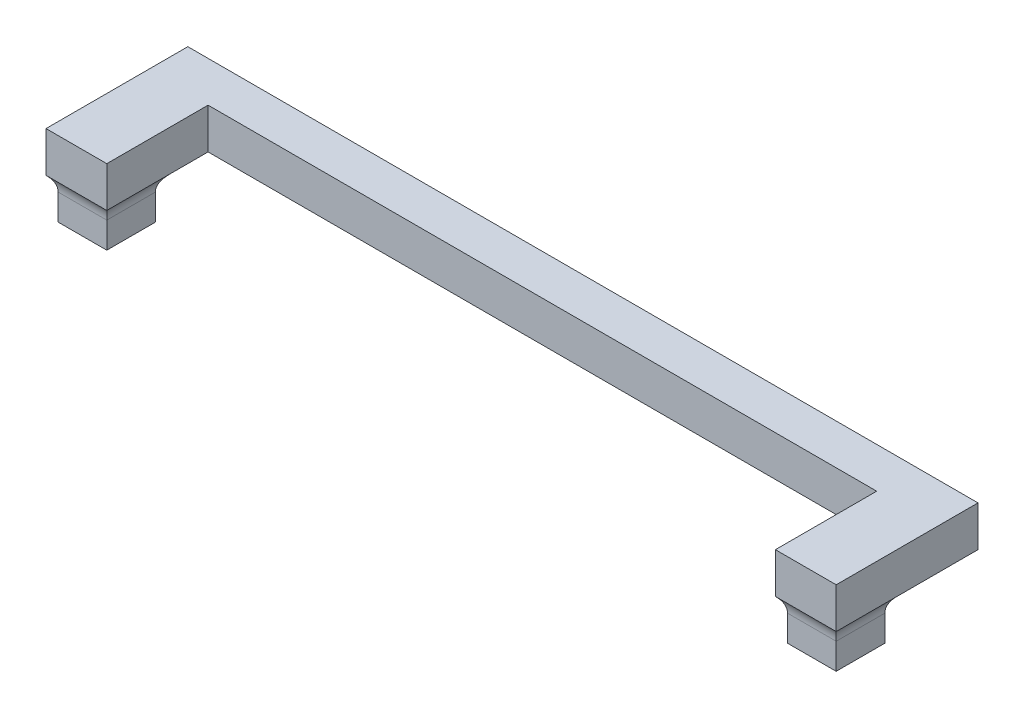
ISO-10303-21;
HEADER;
FILE_DESCRIPTION(('STEP AP214'),'2;1');
FILE_NAME('part.step','',(''),(''),'','','');
FILE_SCHEMA(('AUTOMOTIVE_DESIGN { 1 0 10303 214 1 1 1 1 }'));
ENDSEC;
DATA;
#1=APPLICATION_CONTEXT('core data for automotive mechanical design processes');
#2=APPLICATION_PROTOCOL_DEFINITION('international standard','automotive_design',2000,#1);
#3=PRODUCT_CONTEXT('',#1,'mechanical');
#4=PRODUCT('Part','Part','',(#3));
#5=PRODUCT_RELATED_PRODUCT_CATEGORY('part','',(#4));
#6=PRODUCT_DEFINITION_FORMATION('','',#4);
#7=PRODUCT_DEFINITION_CONTEXT('part definition',#1,'design');
#8=PRODUCT_DEFINITION('design','',#6,#7);
#9=PRODUCT_DEFINITION_SHAPE('','',#8);
#10=(LENGTH_UNIT() NAMED_UNIT(*) SI_UNIT(.MILLI.,.METRE.));
#11=(NAMED_UNIT(*) PLANE_ANGLE_UNIT() SI_UNIT($,.RADIAN.));
#12=(NAMED_UNIT(*) SI_UNIT($,.STERADIAN.) SOLID_ANGLE_UNIT());
#13=UNCERTAINTY_MEASURE_WITH_UNIT(LENGTH_MEASURE(1.E-05),#10,'distance_accuracy_value','');
#14=(GEOMETRIC_REPRESENTATION_CONTEXT(3) GLOBAL_UNCERTAINTY_ASSIGNED_CONTEXT((#13)) GLOBAL_UNIT_ASSIGNED_CONTEXT((#10,
#11,#12)) REPRESENTATION_CONTEXT('',''));
#15=CARTESIAN_POINT('',(0.,0.,0.));
#16=DIRECTION('',(0.,0.,1.));
#17=DIRECTION('',(1.,0.,0.));
#18=AXIS2_PLACEMENT_3D('',#15,#16,#17);
#19=CARTESIAN_POINT('',(6.858,5.08,-17.018));
#20=DIRECTION('',(0.,1.,0.));
#21=DIRECTION('',(0.,0.,1.));
#22=AXIS2_PLACEMENT_3D('',#19,#20,#21);
#23=PLANE('',#22);
#24=DIRECTION('',(0.,0.,-1.));
#25=VECTOR('',#24,1.);
#26=CARTESIAN_POINT('',(-84.582,5.08,0.762000000000001));
#27=LINE('',#26,#25);
#28=CARTESIAN_POINT('',(-84.582,5.08,-7.874));
#29=VERTEX_POINT('',#28);
#30=CARTESIAN_POINT('',(-84.582,5.08,-11.938));
#31=VERTEX_POINT('',#30);
#32=EDGE_CURVE('E228',#29,#31,#27,.T.);
#33=ORIENTED_EDGE('',*,*,#32,.F.);
#34=DIRECTION('',(1.,0.,0.));
#35=VECTOR('',#34,1.);
#36=CARTESIAN_POINT('',(-92.202,5.08,-7.874));
#37=LINE('',#36,#35);
#38=CARTESIAN_POINT('',(-92.202,5.08,-7.874));
#39=VERTEX_POINT('',#38);
#40=EDGE_CURVE('E388',#29,#39,#37,.F.);
#41=ORIENTED_EDGE('',*,*,#40,.T.);
#42=DIRECTION('',(0.,0.,1.));
#43=VECTOR('',#42,1.);
#44=CARTESIAN_POINT('',(-92.202,5.08,-17.018));
#45=LINE('',#44,#43);
#46=CARTESIAN_POINT('',(-92.202,5.08,-17.018));
#47=VERTEX_POINT('',#46);
#48=EDGE_CURVE('E240',#47,#39,#45,.T.);
#49=ORIENTED_EDGE('',*,*,#48,.F.);
#50=DIRECTION('',(-1.,0.,0.));
#51=VECTOR('',#50,1.);
#52=CARTESIAN_POINT('',(6.858,5.08,-17.018));
#53=LINE('',#52,#51);
#54=CARTESIAN_POINT('',(6.858,5.08,-17.018));
#55=VERTEX_POINT('',#54);
#56=EDGE_CURVE('E262',#55,#47,#53,.T.);
#57=ORIENTED_EDGE('',*,*,#56,.F.);
#58=DIRECTION('',(0.,0.,1.));
#59=VECTOR('',#58,1.);
#60=CARTESIAN_POINT('',(6.858,5.08,-17.018));
#61=LINE('',#60,#59);
#62=CARTESIAN_POINT('',(6.858,5.08,-6.858));
#63=VERTEX_POINT('',#62);
#64=EDGE_CURVE('E272',#55,#63,#61,.T.);
#65=ORIENTED_EDGE('',*,*,#64,.T.);
#66=DIRECTION('',(-1.,0.,0.));
#67=VECTOR('',#66,1.);
#68=CARTESIAN_POINT('',(-0.762000000000002,5.08,-6.858));
#69=LINE('',#68,#67);
#70=CARTESIAN_POINT('',(-0.762000000000002,5.08,-6.858));
#71=VERTEX_POINT('',#70);
#72=EDGE_CURVE('E281',#63,#71,#69,.T.);
#73=ORIENTED_EDGE('',*,*,#72,.T.);
#74=DIRECTION('',(0.,0.,1.));
#75=VECTOR('',#74,1.);
#76=CARTESIAN_POINT('',(-0.762000000000003,5.08,-17.018));
#77=LINE('',#76,#75);
#78=CARTESIAN_POINT('',(-0.762000000000002,5.08,-11.938));
#79=VERTEX_POINT('',#78);
#80=EDGE_CURVE('E269',#79,#71,#77,.T.);
#81=ORIENTED_EDGE('',*,*,#80,.F.);
#82=DIRECTION('',(1.,0.,0.));
#83=VECTOR('',#82,1.);
#84=CARTESIAN_POINT('',(-84.582,5.08,-11.938));
#85=LINE('',#84,#83);
#86=EDGE_CURVE('E255',#31,#79,#85,.T.);
#87=ORIENTED_EDGE('',*,*,#86,.F.);
#88=EDGE_LOOP('',(#33,#41,#49,#57,#65,#73,#81,#87));
#89=FACE_BOUND('',#88,.T.);
#90=ADVANCED_FACE('F43',(#89),#23,.F.);
#91=CARTESIAN_POINT('',(-84.582,10.16,-11.938));
#92=DIRECTION('',(0.,0.,-1.));
#93=DIRECTION('',(-1.,0.,0.));
#94=AXIS2_PLACEMENT_3D('',#91,#92,#93);
#95=PLANE('',#94);
#96=DIRECTION('',(0.,1.,0.));
#97=VECTOR('',#96,1.);
#98=CARTESIAN_POINT('',(-84.582,10.16,-11.938));
#99=LINE('',#98,#97);
#100=CARTESIAN_POINT('',(-84.582,10.16,-11.938));
#101=VERTEX_POINT('',#100);
#102=EDGE_CURVE('E203',#31,#101,#99,.T.);
#103=ORIENTED_EDGE('',*,*,#102,.F.);
#104=ORIENTED_EDGE('',*,*,#86,.T.);
#105=DIRECTION('',(0.,1.,0.));
#106=VECTOR('',#105,1.);
#107=CARTESIAN_POINT('',(-0.762000000000002,10.16,-11.938));
#108=LINE('',#107,#106);
#109=CARTESIAN_POINT('',(-0.762000000000002,10.16,-11.938));
#110=VERTEX_POINT('',#109);
#111=EDGE_CURVE('E248',#79,#110,#108,.T.);
#112=ORIENTED_EDGE('',*,*,#111,.T.);
#113=DIRECTION('',(1.,0.,0.));
#114=VECTOR('',#113,1.);
#115=CARTESIAN_POINT('',(-84.582,10.16,-11.938));
#116=LINE('',#115,#114);
#117=EDGE_CURVE('E252',#101,#110,#116,.T.);
#118=ORIENTED_EDGE('',*,*,#117,.F.);
#119=EDGE_LOOP('',(#103,#104,#112,#118));
#120=FACE_BOUND('',#119,.T.);
#121=ADVANCED_FACE('F419',(#120),#95,.F.);
#122=CARTESIAN_POINT('',(-0.762000000000002,10.16,-6.858));
#123=DIRECTION('',(1.,0.,0.));
#124=DIRECTION('',(0.,0.,-1.));
#125=AXIS2_PLACEMENT_3D('',#122,#123,#124);
#126=PLANE('',#125);
#127=ORIENTED_EDGE('',*,*,#111,.F.);
#128=ORIENTED_EDGE('',*,*,#80,.T.);
#129=DIRECTION('',(0.,0.,1.));
#130=VECTOR('',#129,1.);
#131=CARTESIAN_POINT('',(-0.762000000000002,5.08,-6.858));
#132=LINE('',#131,#130);
#133=CARTESIAN_POINT('',(-0.762000000000002,5.08,0.762));
#134=VERTEX_POINT('',#133);
#135=EDGE_CURVE('E288',#71,#134,#132,.T.);
#136=ORIENTED_EDGE('',*,*,#135,.T.);
#137=DIRECTION('',(0.,-1.,0.));
#138=VECTOR('',#137,1.);
#139=CARTESIAN_POINT('',(-0.762000000000002,10.16,0.762));
#140=LINE('',#139,#138);
#141=CARTESIAN_POINT('',(-0.762000000000002,10.16,0.762));
#142=VERTEX_POINT('',#141);
#143=EDGE_CURVE('E307',#142,#134,#140,.T.);
#144=ORIENTED_EDGE('',*,*,#143,.F.);
#145=DIRECTION('',(0.,0.,1.));
#146=VECTOR('',#145,1.);
#147=CARTESIAN_POINT('',(-0.762000000000002,10.16,-6.858));
#148=LINE('',#147,#146);
#149=EDGE_CURVE('E277',#110,#142,#148,.T.);
#150=ORIENTED_EDGE('',*,*,#149,.F.);
#151=EDGE_LOOP('',(#127,#128,#136,#144,#150));
#152=FACE_BOUND('',#151,.T.);
#153=ADVANCED_FACE('F425',(#152),#126,.F.);
#154=CARTESIAN_POINT('',(0.,5.08,0.));
#155=DIRECTION('',(1.,0.,0.));
#156=DIRECTION('',(0.,0.,-1.));
#157=AXIS2_PLACEMENT_3D('',#154,#155,#156);
#158=PLANE('',#157);
#159=DIRECTION('',(0.,-1.,0.));
#160=VECTOR('',#159,1.);
#161=CARTESIAN_POINT('',(0.,5.08,0.));
#162=LINE('',#161,#160);
#163=CARTESIAN_POINT('',(0.,3.26607717915011,0.));
#164=VERTEX_POINT('',#163);
#165=CARTESIAN_POINT('',(0.,0.,0.));
#166=VERTEX_POINT('',#165);
#167=EDGE_CURVE('E335',#164,#166,#162,.T.);
#168=ORIENTED_EDGE('',*,*,#167,.F.);
#169=DIRECTION('',(0.,0.,-1.));
#170=VECTOR('',#169,1.);
#171=CARTESIAN_POINT('',(0.,3.26607717915011,0.));
#172=LINE('',#171,#170);
#173=CARTESIAN_POINT('',(0.,3.26607717915011,-6.096));
#174=VERTEX_POINT('',#173);
#175=EDGE_CURVE('E348',#164,#174,#172,.T.);
#176=ORIENTED_EDGE('',*,*,#175,.T.);
#177=DIRECTION('',(0.,-1.,0.));
#178=VECTOR('',#177,1.);
#179=CARTESIAN_POINT('',(0.,5.08,-6.096));
#180=LINE('',#179,#178);
#181=CARTESIAN_POINT('',(0.,0.,-6.096));
#182=VERTEX_POINT('',#181);
#183=EDGE_CURVE('E326',#174,#182,#180,.T.);
#184=ORIENTED_EDGE('',*,*,#183,.T.);
#185=DIRECTION('',(0.,0.,1.));
#186=VECTOR('',#185,1.);
#187=CARTESIAN_POINT('',(0.,0.,0.));
#188=LINE('',#187,#186);
#189=EDGE_CURVE('E310',#182,#166,#188,.T.);
#190=ORIENTED_EDGE('',*,*,#189,.T.);
#191=EDGE_LOOP('',(#168,#176,#184,#190));
#192=FACE_BOUND('',#191,.T.);
#193=ADVANCED_FACE('F446',(#192),#158,.F.);
#194=CARTESIAN_POINT('',(0.,5.08,0.));
#195=DIRECTION('',(0.,0.,-1.));
#196=DIRECTION('',(-1.,0.,0.));
#197=AXIS2_PLACEMENT_3D('',#194,#195,#196);
#198=PLANE('',#197);
#199=DIRECTION('',(0.,-1.,0.));
#200=VECTOR('',#199,1.);
#201=CARTESIAN_POINT('',(6.096,5.08,0.));
#202=LINE('',#201,#200);
#203=CARTESIAN_POINT('',(6.096,3.26607717915012,0.));
#204=VERTEX_POINT('',#203);
#205=CARTESIAN_POINT('',(6.096,0.,0.));
#206=VERTEX_POINT('',#205);
#207=EDGE_CURVE('E332',#204,#206,#202,.T.);
#208=ORIENTED_EDGE('',*,*,#207,.F.);
#209=DIRECTION('',(-1.,0.,0.));
#210=VECTOR('',#209,1.);
#211=CARTESIAN_POINT('',(0.,3.26607717915012,0.));
#212=LINE('',#211,#210);
#213=EDGE_CURVE('E338',#204,#164,#212,.T.);
#214=ORIENTED_EDGE('',*,*,#213,.T.);
#215=ORIENTED_EDGE('',*,*,#167,.T.);
#216=DIRECTION('',(1.,0.,0.));
#217=VECTOR('',#216,1.);
#218=CARTESIAN_POINT('',(0.,0.,0.));
#219=LINE('',#218,#217);
#220=EDGE_CURVE('E314',#166,#206,#219,.T.);
#221=ORIENTED_EDGE('',*,*,#220,.T.);
#222=EDGE_LOOP('',(#208,#214,#215,#221));
#223=FACE_BOUND('',#222,.T.);
#224=ADVANCED_FACE('F458',(#223),#198,.F.);
#225=CARTESIAN_POINT('',(6.096,5.08,0.));
#226=DIRECTION('',(-1.,0.,0.));
#227=DIRECTION('',(0.,0.,1.));
#228=AXIS2_PLACEMENT_3D('',#225,#226,#227);
#229=PLANE('',#228);
#230=DIRECTION('',(0.,-1.,0.));
#231=VECTOR('',#230,1.);
#232=CARTESIAN_POINT('',(6.096,5.08,-6.096));
#233=LINE('',#232,#231);
#234=CARTESIAN_POINT('',(6.096,3.26607717915012,-6.096));
#235=VERTEX_POINT('',#234);
#236=CARTESIAN_POINT('',(6.096,0.,-6.096));
#237=VERTEX_POINT('',#236);
#238=EDGE_CURVE('E329',#235,#237,#233,.T.);
#239=ORIENTED_EDGE('',*,*,#238,.F.);
#240=DIRECTION('',(0.,0.,1.));
#241=VECTOR('',#240,1.);
#242=CARTESIAN_POINT('',(6.096,3.26607717915012,0.));
#243=LINE('',#242,#241);
#244=EDGE_CURVE('E342',#235,#204,#243,.T.);
#245=ORIENTED_EDGE('',*,*,#244,.T.);
#246=ORIENTED_EDGE('',*,*,#207,.T.);
#247=DIRECTION('',(0.,0.,-1.));
#248=VECTOR('',#247,1.);
#249=CARTESIAN_POINT('',(6.096,0.,0.));
#250=LINE('',#249,#248);
#251=EDGE_CURVE('E318',#206,#237,#250,.T.);
#252=ORIENTED_EDGE('',*,*,#251,.T.);
#253=EDGE_LOOP('',(#239,#245,#246,#252));
#254=FACE_BOUND('',#253,.T.);
#255=ADVANCED_FACE('F454',(#254),#229,.F.);
#256=CARTESIAN_POINT('',(0.,5.08,-6.096));
#257=DIRECTION('',(0.,0.,1.));
#258=DIRECTION('',(1.,0.,0.));
#259=AXIS2_PLACEMENT_3D('',#256,#257,#258);
#260=PLANE('',#259);
#261=ORIENTED_EDGE('',*,*,#183,.F.);
#262=DIRECTION('',(1.,0.,0.));
#263=VECTOR('',#262,1.);
#264=CARTESIAN_POINT('',(0.,3.26607717915012,-6.096));
#265=LINE('',#264,#263);
#266=EDGE_CURVE('E345',#174,#235,#265,.T.);
#267=ORIENTED_EDGE('',*,*,#266,.T.);
#268=ORIENTED_EDGE('',*,*,#238,.T.);
#269=DIRECTION('',(-1.,0.,0.));
#270=VECTOR('',#269,1.);
#271=CARTESIAN_POINT('',(0.,0.,-6.096));
#272=LINE('',#271,#270);
#273=EDGE_CURVE('E322',#237,#182,#272,.T.);
#274=ORIENTED_EDGE('',*,*,#273,.T.);
#275=EDGE_LOOP('',(#261,#267,#268,#274));
#276=FACE_BOUND('',#275,.T.);
#277=ADVANCED_FACE('F450',(#276),#260,.F.);
#278=CARTESIAN_POINT('',(0.,0.,0.));
#279=DIRECTION('',(0.,-1.,0.));
#280=DIRECTION('',(0.,0.,-1.));
#281=AXIS2_PLACEMENT_3D('',#278,#279,#280);
#282=PLANE('',#281);
#283=ORIENTED_EDGE('',*,*,#189,.F.);
#284=ORIENTED_EDGE('',*,*,#273,.F.);
#285=ORIENTED_EDGE('',*,*,#251,.F.);
#286=ORIENTED_EDGE('',*,*,#220,.F.);
#287=EDGE_LOOP('',(#283,#284,#285,#286));
#288=FACE_BOUND('',#287,.T.);
#289=ADVANCED_FACE('F442',(#288),#282,.T.);
#290=CARTESIAN_POINT('',(-0.762000000000002,10.16,0.762));
#291=DIRECTION('',(0.,0.,-1.));
#292=DIRECTION('',(-1.,0.,0.));
#293=AXIS2_PLACEMENT_3D('',#290,#291,#292);
#294=PLANE('',#293);
#295=DIRECTION('',(1.,0.,0.));
#296=VECTOR('',#295,1.);
#297=CARTESIAN_POINT('',(-0.762000000000002,5.08,0.762));
#298=LINE('',#297,#296);
#299=CARTESIAN_POINT('',(6.858,5.08,0.762));
#300=VERTEX_POINT('',#299);
#301=EDGE_CURVE('E292',#134,#300,#298,.T.);
#302=ORIENTED_EDGE('',*,*,#301,.T.);
#303=DIRECTION('',(0.,-1.,0.));
#304=VECTOR('',#303,1.);
#305=CARTESIAN_POINT('',(6.858,10.16,0.762));
#306=LINE('',#305,#304);
#307=CARTESIAN_POINT('',(6.858,10.16,0.762));
#308=VERTEX_POINT('',#307);
#309=EDGE_CURVE('E287',#308,#300,#306,.T.);
#310=ORIENTED_EDGE('',*,*,#309,.F.);
#311=DIRECTION('',(1.,0.,0.));
#312=VECTOR('',#311,1.);
#313=CARTESIAN_POINT('',(-0.762000000000002,10.16,0.762));
#314=LINE('',#313,#312);
#315=EDGE_CURVE('E280',#142,#308,#314,.T.);
#316=ORIENTED_EDGE('',*,*,#315,.F.);
#317=ORIENTED_EDGE('',*,*,#143,.T.);
#318=EDGE_LOOP('',(#302,#310,#316,#317));
#319=FACE_BOUND('',#318,.T.);
#320=ADVANCED_FACE('F438',(#319),#294,.F.);
#321=CARTESIAN_POINT('',(6.858,10.16,-6.858));
#322=DIRECTION('',(-1.,0.,0.));
#323=DIRECTION('',(0.,0.,1.));
#324=AXIS2_PLACEMENT_3D('',#321,#322,#323);
#325=PLANE('',#324);
#326=DIRECTION('',(0.,0.,-1.));
#327=VECTOR('',#326,1.);
#328=CARTESIAN_POINT('',(6.858,5.08,-6.858));
#329=LINE('',#328,#327);
#330=EDGE_CURVE('E297',#300,#63,#329,.T.);
#331=ORIENTED_EDGE('',*,*,#330,.T.);
#332=ORIENTED_EDGE('',*,*,#64,.F.);
#333=DIRECTION('',(0.,-1.,0.));
#334=VECTOR('',#333,1.);
#335=CARTESIAN_POINT('',(6.858,10.16,-17.018));
#336=LINE('',#335,#334);
#337=CARTESIAN_POINT('',(6.858,10.16,-17.018));
#338=VERTEX_POINT('',#337);
#339=EDGE_CURVE('E258',#338,#55,#336,.T.);
#340=ORIENTED_EDGE('',*,*,#339,.F.);
#341=DIRECTION('',(0.,0.,-1.));
#342=VECTOR('',#341,1.);
#343=CARTESIAN_POINT('',(6.858,10.16,-6.858));
#344=LINE('',#343,#342);
#345=EDGE_CURVE('E284',#308,#338,#344,.T.);
#346=ORIENTED_EDGE('',*,*,#345,.F.);
#347=ORIENTED_EDGE('',*,*,#309,.T.);
#348=EDGE_LOOP('',(#331,#332,#340,#346,#347));
#349=FACE_BOUND('',#348,.T.);
#350=ADVANCED_FACE('F434',(#349),#325,.F.);
#351=CARTESIAN_POINT('',(0.,10.16,0.));
#352=DIRECTION('',(0.,1.,0.));
#353=DIRECTION('',(0.,0.,1.));
#354=AXIS2_PLACEMENT_3D('',#351,#352,#353);
#355=PLANE('',#354);
#356=DIRECTION('',(1.,0.,0.));
#357=VECTOR('',#356,1.);
#358=CARTESIAN_POINT('',(6.858,10.16,-17.018));
#359=LINE('',#358,#357);
#360=CARTESIAN_POINT('',(-92.202,10.16,-17.018));
#361=VERTEX_POINT('',#360);
#362=EDGE_CURVE('E265',#361,#338,#359,.T.);
#363=ORIENTED_EDGE('',*,*,#362,.F.);
#364=DIRECTION('',(0.,0.,-1.));
#365=VECTOR('',#364,1.);
#366=CARTESIAN_POINT('',(-92.202,10.16,-17.018));
#367=LINE('',#366,#365);
#368=CARTESIAN_POINT('',(-92.202,10.16,0.762000000000001));
#369=VERTEX_POINT('',#368);
#370=EDGE_CURVE('E244',#369,#361,#367,.T.);
#371=ORIENTED_EDGE('',*,*,#370,.F.);
#372=DIRECTION('',(-1.,0.,0.));
#373=VECTOR('',#372,1.);
#374=CARTESIAN_POINT('',(-84.582,10.16,0.762000000000001));
#375=LINE('',#374,#373);
#376=CARTESIAN_POINT('',(-84.582,10.16,0.762000000000001));
#377=VERTEX_POINT('',#376);
#378=EDGE_CURVE('E217',#377,#369,#375,.T.);
#379=ORIENTED_EDGE('',*,*,#378,.F.);
#380=DIRECTION('',(0.,0.,-1.));
#381=VECTOR('',#380,1.);
#382=CARTESIAN_POINT('',(-84.582,10.16,0.762000000000001));
#383=LINE('',#382,#381);
#384=EDGE_CURVE('E232',#377,#101,#383,.T.);
#385=ORIENTED_EDGE('',*,*,#384,.T.);
#386=ORIENTED_EDGE('',*,*,#117,.T.);
#387=ORIENTED_EDGE('',*,*,#149,.T.);
#388=ORIENTED_EDGE('',*,*,#315,.T.);
#389=ORIENTED_EDGE('',*,*,#345,.T.);
#390=EDGE_LOOP('',(#363,#371,#379,#385,#386,#387,#388,#389));
#391=FACE_BOUND('',#390,.T.);
#392=ADVANCED_FACE('F431',(#391),#355,.T.);
#393=CARTESIAN_POINT('',(0.,3.26607717915012,-8.636));
#394=DIRECTION('',(1.,0.,0.));
#395=DIRECTION('',(0.,0.,-1.));
#396=AXIS2_PLACEMENT_3D('',#393,#394,#395);
#397=CYLINDRICAL_SURFACE('',#396,2.54);
#398=CARTESIAN_POINT('',(8.636,3.26607717915012,-8.636));
#399=DIRECTION('',(0.707106781186548,0.,0.707106781186547));
#400=DIRECTION('',(0.707106781186547,0.,-0.707106781186548));
#401=AXIS2_PLACEMENT_3D('',#398,#399,#400);
#402=ELLIPSE('',#401,3.59210244842766,2.54);
#403=EDGE_CURVE('E357',#235,#63,#402,.F.);
#404=ORIENTED_EDGE('',*,*,#403,.F.);
#405=ORIENTED_EDGE('',*,*,#266,.F.);
#406=CARTESIAN_POINT('',(-2.54,3.26607717915012,-8.636));
#407=DIRECTION('',(0.707106781186547,0.,-0.707106781186548));
#408=DIRECTION('',(0.707106781186548,0.,0.707106781186547));
#409=AXIS2_PLACEMENT_3D('',#406,#407,#408);
#410=ELLIPSE('',#409,3.59210244842766,2.54);
#411=EDGE_CURVE('E293',#71,#174,#410,.T.);
#412=ORIENTED_EDGE('',*,*,#411,.F.);
#413=ORIENTED_EDGE('',*,*,#72,.F.);
#414=EDGE_LOOP('',(#404,#405,#412,#413));
#415=FACE_BOUND('',#414,.T.);
#416=ADVANCED_FACE('F405',(#415),#397,.F.);
#417=CARTESIAN_POINT('',(-2.54,3.26607717915011,0.));
#418=DIRECTION('',(0.,0.,-1.));
#419=DIRECTION('',(-1.,0.,0.));
#420=AXIS2_PLACEMENT_3D('',#417,#418,#419);
#421=CYLINDRICAL_SURFACE('',#420,2.54);
#422=ORIENTED_EDGE('',*,*,#411,.T.);
#423=ORIENTED_EDGE('',*,*,#175,.F.);
#424=CARTESIAN_POINT('',(-2.54,3.26607717915012,2.54));
#425=DIRECTION('',(-0.707106781186547,0.,-0.707106781186547));
#426=DIRECTION('',(0.707106781186547,0.,-0.707106781186547));
#427=AXIS2_PLACEMENT_3D('',#424,#425,#426);
#428=ELLIPSE('',#427,3.59210244842766,2.54);
#429=EDGE_CURVE('E354',#134,#164,#428,.T.);
#430=ORIENTED_EDGE('',*,*,#429,.F.);
#431=ORIENTED_EDGE('',*,*,#135,.F.);
#432=EDGE_LOOP('',(#422,#423,#430,#431));
#433=FACE_BOUND('',#432,.T.);
#434=ADVANCED_FACE('F472',(#433),#421,.F.);
#435=CARTESIAN_POINT('',(8.636,3.26607717915012,0.));
#436=DIRECTION('',(0.,0.,1.));
#437=DIRECTION('',(1.,0.,0.));
#438=AXIS2_PLACEMENT_3D('',#435,#436,#437);
#439=CYLINDRICAL_SURFACE('',#438,2.54);
#440=ORIENTED_EDGE('',*,*,#403,.T.);
#441=ORIENTED_EDGE('',*,*,#330,.F.);
#442=CARTESIAN_POINT('',(8.636,3.26607717915012,2.54));
#443=DIRECTION('',(-0.707106781186547,0.,0.707106781186548));
#444=DIRECTION('',(-0.707106781186548,0.,-0.707106781186547));
#445=AXIS2_PLACEMENT_3D('',#442,#443,#444);
#446=ELLIPSE('',#445,3.59210244842766,2.54);
#447=EDGE_CURVE('E276',#204,#300,#446,.F.);
#448=ORIENTED_EDGE('',*,*,#447,.F.);
#449=ORIENTED_EDGE('',*,*,#244,.F.);
#450=EDGE_LOOP('',(#440,#441,#448,#449));
#451=FACE_BOUND('',#450,.T.);
#452=ADVANCED_FACE('F469',(#451),#439,.F.);
#453=CARTESIAN_POINT('',(0.,3.26607717915012,2.54));
#454=DIRECTION('',(-1.,0.,0.));
#455=DIRECTION('',(0.,0.,1.));
#456=AXIS2_PLACEMENT_3D('',#453,#454,#455);
#457=CYLINDRICAL_SURFACE('',#456,2.54);
#458=ORIENTED_EDGE('',*,*,#429,.T.);
#459=ORIENTED_EDGE('',*,*,#213,.F.);
#460=ORIENTED_EDGE('',*,*,#447,.T.);
#461=ORIENTED_EDGE('',*,*,#301,.F.);
#462=EDGE_LOOP('',(#458,#459,#460,#461));
#463=FACE_BOUND('',#462,.T.);
#464=ADVANCED_FACE('F466',(#463),#457,.F.);
#465=CARTESIAN_POINT('',(0.,0.,-17.018));
#466=DIRECTION('',(0.,0.,-1.));
#467=DIRECTION('',(-1.,0.,0.));
#468=AXIS2_PLACEMENT_3D('',#465,#466,#467);
#469=PLANE('',#468);
#470=ORIENTED_EDGE('',*,*,#339,.T.);
#471=ORIENTED_EDGE('',*,*,#56,.T.);
#472=DIRECTION('',(0.,-1.,0.));
#473=VECTOR('',#472,1.);
#474=CARTESIAN_POINT('',(-92.202,10.16,-17.018));
#475=LINE('',#474,#473);
#476=EDGE_CURVE('E235',#361,#47,#475,.T.);
#477=ORIENTED_EDGE('',*,*,#476,.F.);
#478=ORIENTED_EDGE('',*,*,#362,.T.);
#479=EDGE_LOOP('',(#470,#471,#477,#478));
#480=FACE_BOUND('',#479,.T.);
#481=ADVANCED_FACE('F430',(#480),#469,.T.);
#482=CARTESIAN_POINT('',(-92.202,0.,0.));
#483=DIRECTION('',(-1.,0.,0.));
#484=DIRECTION('',(0.,0.,1.));
#485=AXIS2_PLACEMENT_3D('',#482,#483,#484);
#486=PLANE('',#485);
#487=ORIENTED_EDGE('',*,*,#476,.T.);
#488=ORIENTED_EDGE('',*,*,#48,.T.);
#489=CARTESIAN_POINT('',(-92.202,5.08,0.762000000000001));
#490=VERTEX_POINT('',#489);
#491=EDGE_CURVE('E239',#39,#490,#45,.T.);
#492=ORIENTED_EDGE('',*,*,#491,.T.);
#493=DIRECTION('',(0.,-1.,0.));
#494=VECTOR('',#493,1.);
#495=CARTESIAN_POINT('',(-92.202,10.16,0.762000000000001));
#496=LINE('',#495,#494);
#497=EDGE_CURVE('E221',#369,#490,#496,.T.);
#498=ORIENTED_EDGE('',*,*,#497,.F.);
#499=ORIENTED_EDGE('',*,*,#370,.T.);
#500=EDGE_LOOP('',(#487,#488,#492,#498,#499));
#501=FACE_BOUND('',#500,.T.);
#502=ADVANCED_FACE('F510',(#501),#486,.T.);
#503=CARTESIAN_POINT('',(-84.582,10.16,0.762000000000001));
#504=DIRECTION('',(-1.,0.,0.));
#505=DIRECTION('',(0.,0.,1.));
#506=AXIS2_PLACEMENT_3D('',#503,#504,#505);
#507=PLANE('',#506);
#508=ORIENTED_EDGE('',*,*,#102,.T.);
#509=ORIENTED_EDGE('',*,*,#384,.F.);
#510=DIRECTION('',(0.,1.,0.));
#511=VECTOR('',#510,1.);
#512=CARTESIAN_POINT('',(-84.582,10.16,0.762000000000001));
#513=LINE('',#512,#511);
#514=CARTESIAN_POINT('',(-84.582,5.08,0.762000000000001));
#515=VERTEX_POINT('',#514);
#516=EDGE_CURVE('E208',#515,#377,#513,.T.);
#517=ORIENTED_EDGE('',*,*,#516,.F.);
#518=EDGE_CURVE('E64',#515,#29,#27,.T.);
#519=ORIENTED_EDGE('',*,*,#518,.T.);
#520=ORIENTED_EDGE('',*,*,#32,.T.);
#521=EDGE_LOOP('',(#508,#509,#517,#519,#520));
#522=FACE_BOUND('',#521,.T.);
#523=ADVANCED_FACE('F518',(#522),#507,.F.);
#524=CARTESIAN_POINT('',(0.,0.,0.762000000000001));
#525=DIRECTION('',(0.,0.,-1.));
#526=DIRECTION('',(-1.,0.,0.));
#527=AXIS2_PLACEMENT_3D('',#524,#525,#526);
#528=PLANE('',#527);
#529=ORIENTED_EDGE('',*,*,#516,.T.);
#530=ORIENTED_EDGE('',*,*,#378,.T.);
#531=ORIENTED_EDGE('',*,*,#497,.T.);
#532=DIRECTION('',(1.,0.,0.));
#533=VECTOR('',#532,1.);
#534=CARTESIAN_POINT('',(-84.582,5.08,0.762000000000001));
#535=LINE('',#534,#533);
#536=EDGE_CURVE('E225',#490,#515,#535,.T.);
#537=ORIENTED_EDGE('',*,*,#536,.T.);
#538=EDGE_LOOP('',(#529,#530,#531,#537));
#539=FACE_BOUND('',#538,.T.);
#540=ADVANCED_FACE('F515',(#539),#528,.F.);
#541=CARTESIAN_POINT('',(-91.44,0.,0.));
#542=DIRECTION('',(1.,0.,0.));
#543=DIRECTION('',(0.,0.,-1.));
#544=AXIS2_PLACEMENT_3D('',#541,#542,#543);
#545=PLANE('',#544);
#546=DIRECTION('',(0.,1.,0.));
#547=VECTOR('',#546,1.);
#548=CARTESIAN_POINT('',(-91.44,0.,0.));
#549=LINE('',#548,#547);
#550=CARTESIAN_POINT('',(-91.44,0.,0.));
#551=VERTEX_POINT('',#550);
#552=CARTESIAN_POINT('',(-91.44,3.26607717915012,0.));
#553=VERTEX_POINT('',#552);
#554=EDGE_CURVE('E537',#551,#553,#549,.T.);
#555=ORIENTED_EDGE('',*,*,#554,.T.);
#556=DIRECTION('',(0.,0.,1.));
#557=VECTOR('',#556,1.);
#558=CARTESIAN_POINT('',(-91.44,3.26607717915012,0.));
#559=LINE('',#558,#557);
#560=CARTESIAN_POINT('',(-91.44,3.26607717915012,-6.096));
#561=VERTEX_POINT('',#560);
#562=EDGE_CURVE('E201',#553,#561,#559,.F.);
#563=ORIENTED_EDGE('',*,*,#562,.T.);
#564=DIRECTION('',(0.,1.,0.));
#565=VECTOR('',#564,1.);
#566=CARTESIAN_POINT('',(-91.44,0.,-6.096));
#567=LINE('',#566,#565);
#568=CARTESIAN_POINT('',(-91.44,0.,-6.096));
#569=VERTEX_POINT('',#568);
#570=EDGE_CURVE('E180',#569,#561,#567,.T.);
#571=ORIENTED_EDGE('',*,*,#570,.F.);
#572=DIRECTION('',(0.,0.,-1.));
#573=VECTOR('',#572,1.);
#574=CARTESIAN_POINT('',(-91.44,0.,0.));
#575=LINE('',#574,#573);
#576=EDGE_CURVE('E187',#551,#569,#575,.T.);
#577=ORIENTED_EDGE('',*,*,#576,.F.);
#578=EDGE_LOOP('',(#555,#563,#571,#577));
#579=FACE_BOUND('',#578,.T.);
#580=ADVANCED_FACE('F199',(#579),#545,.F.);
#581=CARTESIAN_POINT('',(-91.44,0.,-6.096));
#582=DIRECTION('',(0.,0.,1.));
#583=DIRECTION('',(1.,0.,0.));
#584=AXIS2_PLACEMENT_3D('',#581,#582,#583);
#585=PLANE('',#584);
#586=CARTESIAN_POINT('',(-93.98,3.26607717915012,-6.096));
#587=DIRECTION('',(0.,0.,1.));
#588=DIRECTION('',(1.,0.,0.));
#589=AXIS2_PLACEMENT_3D('',#586,#587,#588);
#590=CIRCLE('',#589,2.54);
#591=CARTESIAN_POINT('',(-91.4402540381089,3.302,-6.096));
#592=VERTEX_POINT('',#591);
#593=EDGE_CURVE('E378',#561,#592,#590,.T.);
#594=ORIENTED_EDGE('',*,*,#593,.T.);
#595=DIRECTION('',(1.,0.,0.));
#596=VECTOR('',#595,1.);
#597=CARTESIAN_POINT('',(-84.582,3.302,-6.096));
#598=LINE('',#597,#596);
#599=CARTESIAN_POINT('',(-85.3437459618911,3.302,-6.096));
#600=VERTEX_POINT('',#599);
#601=EDGE_CURVE('E384',#592,#600,#598,.T.);
#602=ORIENTED_EDGE('',*,*,#601,.T.);
#603=CARTESIAN_POINT('',(-82.804,3.26607717915012,-6.096));
#604=DIRECTION('',(0.,0.,1.));
#605=DIRECTION('',(1.,0.,0.));
#606=AXIS2_PLACEMENT_3D('',#603,#604,#605);
#607=CIRCLE('',#606,2.54);
#608=CARTESIAN_POINT('',(-85.344,3.26607717915012,-6.096));
#609=VERTEX_POINT('',#608);
#610=EDGE_CURVE('E366',#600,#609,#607,.T.);
#611=ORIENTED_EDGE('',*,*,#610,.T.);
#612=DIRECTION('',(0.,1.,0.));
#613=VECTOR('',#612,1.);
#614=CARTESIAN_POINT('',(-85.344,0.,-6.096));
#615=LINE('',#614,#613);
#616=CARTESIAN_POINT('',(-85.344,0.,-6.096));
#617=VERTEX_POINT('',#616);
#618=EDGE_CURVE('E182',#617,#609,#615,.T.);
#619=ORIENTED_EDGE('',*,*,#618,.F.);
#620=DIRECTION('',(1.,0.,0.));
#621=VECTOR('',#620,1.);
#622=CARTESIAN_POINT('',(-91.44,0.,-6.096));
#623=LINE('',#622,#621);
#624=EDGE_CURVE('E175',#569,#617,#623,.T.);
#625=ORIENTED_EDGE('',*,*,#624,.F.);
#626=ORIENTED_EDGE('',*,*,#570,.T.);
#627=EDGE_LOOP('',(#594,#602,#611,#619,#625,#626));
#628=FACE_BOUND('',#627,.T.);
#629=ADVANCED_FACE('F178',(#628),#585,.F.);
#630=CARTESIAN_POINT('',(-85.344,0.,0.));
#631=DIRECTION('',(-1.,0.,0.));
#632=DIRECTION('',(0.,0.,1.));
#633=AXIS2_PLACEMENT_3D('',#630,#631,#632);
#634=PLANE('',#633);
#635=ORIENTED_EDGE('',*,*,#618,.T.);
#636=DIRECTION('',(0.,0.,1.));
#637=VECTOR('',#636,1.);
#638=CARTESIAN_POINT('',(-85.344,3.26607717915012,0.));
#639=LINE('',#638,#637);
#640=CARTESIAN_POINT('',(-85.344,3.26607717915012,0.));
#641=VERTEX_POINT('',#640);
#642=EDGE_CURVE('E351',#609,#641,#639,.T.);
#643=ORIENTED_EDGE('',*,*,#642,.T.);
#644=DIRECTION('',(0.,1.,0.));
#645=VECTOR('',#644,1.);
#646=CARTESIAN_POINT('',(-85.344,0.,0.));
#647=LINE('',#646,#645);
#648=CARTESIAN_POINT('',(-85.344,0.,0.));
#649=VERTEX_POINT('',#648);
#650=EDGE_CURVE('E210',#649,#641,#647,.T.);
#651=ORIENTED_EDGE('',*,*,#650,.F.);
#652=DIRECTION('',(0.,0.,1.));
#653=VECTOR('',#652,1.);
#654=CARTESIAN_POINT('',(-85.344,0.,0.));
#655=LINE('',#654,#653);
#656=EDGE_CURVE('E186',#617,#649,#655,.T.);
#657=ORIENTED_EDGE('',*,*,#656,.F.);
#658=EDGE_LOOP('',(#635,#643,#651,#657));
#659=FACE_BOUND('',#658,.T.);
#660=ADVANCED_FACE('F532',(#659),#634,.F.);
#661=CARTESIAN_POINT('',(-91.44,0.,0.));
#662=DIRECTION('',(0.,0.,-1.));
#663=DIRECTION('',(-1.,0.,0.));
#664=AXIS2_PLACEMENT_3D('',#661,#662,#663);
#665=PLANE('',#664);
#666=ORIENTED_EDGE('',*,*,#650,.T.);
#667=DIRECTION('',(-1.,0.,0.));
#668=VECTOR('',#667,1.);
#669=CARTESIAN_POINT('',(-91.44,3.26607717915012,0.));
#670=LINE('',#669,#668);
#671=EDGE_CURVE('E369',#641,#553,#670,.T.);
#672=ORIENTED_EDGE('',*,*,#671,.T.);
#673=ORIENTED_EDGE('',*,*,#554,.F.);
#674=DIRECTION('',(-1.,0.,0.));
#675=VECTOR('',#674,1.);
#676=CARTESIAN_POINT('',(-91.44,0.,0.));
#677=LINE('',#676,#675);
#678=EDGE_CURVE('E192',#649,#551,#677,.T.);
#679=ORIENTED_EDGE('',*,*,#678,.F.);
#680=EDGE_LOOP('',(#666,#672,#673,#679));
#681=FACE_BOUND('',#680,.T.);
#682=ADVANCED_FACE('F535',(#681),#665,.F.);
#683=CARTESIAN_POINT('',(0.,0.,0.));
#684=DIRECTION('',(0.,-1.,0.));
#685=DIRECTION('',(0.,0.,-1.));
#686=AXIS2_PLACEMENT_3D('',#683,#684,#685);
#687=PLANE('',#686);
#688=ORIENTED_EDGE('',*,*,#576,.T.);
#689=ORIENTED_EDGE('',*,*,#624,.T.);
#690=ORIENTED_EDGE('',*,*,#656,.T.);
#691=ORIENTED_EDGE('',*,*,#678,.T.);
#692=EDGE_LOOP('',(#688,#689,#690,#691));
#693=FACE_BOUND('',#692,.T.);
#694=ADVANCED_FACE('F190',(#693),#687,.T.);
#695=CARTESIAN_POINT('',(-82.804,3.26607717915012,-17.018));
#696=DIRECTION('',(0.,0.,1.));
#697=DIRECTION('',(1.,0.,0.));
#698=AXIS2_PLACEMENT_3D('',#695,#696,#697);
#699=CYLINDRICAL_SURFACE('',#698,2.54);
#700=ORIENTED_EDGE('',*,*,#610,.F.);
#701=CARTESIAN_POINT('',(-85.3437459618911,3.302,-6.096));
#702=CARTESIAN_POINT('',(-85.3431254350761,3.34656724854848,-6.09599098565692));
#703=CARTESIAN_POINT('',(-85.3413125471869,3.39111012939394,-6.09767536215139));
#704=CARTESIAN_POINT('',(-85.3353823591851,3.47976529949936,-6.10435318886083));
#705=CARTESIAN_POINT('',(-85.3312665138797,3.5238778427276,-6.10934455037759));
#706=CARTESIAN_POINT('',(-85.3208435342782,3.61106492465966,-6.12251611268982));
#707=CARTESIAN_POINT('',(-85.3145507359842,3.65414432976072,-6.13067549294434));
#708=CARTESIAN_POINT('',(-85.2999122919093,3.7392463207871,-6.15004915003327));
#709=CARTESIAN_POINT('',(-85.2915664175409,3.78126878845944,-6.16126376704961));
#710=CARTESIAN_POINT('',(-85.2637390629356,3.90514899886935,-6.19920862525531));
#711=CARTESIAN_POINT('',(-85.2414335166176,3.98509369463268,-6.23028256446079));
#712=CARTESIAN_POINT('',(-85.1909408544361,4.13822753282869,-6.30262815549163));
#713=CARTESIAN_POINT('',(-85.1627457900906,4.21140735085918,-6.34391360275444));
#714=CARTESIAN_POINT('',(-85.0995200797155,4.35649164540448,-6.43958054938177));
#715=CARTESIAN_POINT('',(-85.0640992932465,4.42766020115448,-6.49481714510716));
#716=CARTESIAN_POINT('',(-84.9908478867892,4.56031597999438,-6.61466175226241));
#717=CARTESIAN_POINT('',(-84.9530138634368,4.62178908589018,-6.67928317054831));
#718=CARTESIAN_POINT('',(-84.8708310811436,4.74465424896985,-6.82945254383843));
#719=CARTESIAN_POINT('',(-84.8265329772318,4.80404785737678,-6.91667436215656));
#720=CARTESIAN_POINT('',(-84.7436551840263,4.90733046190067,-7.10235596910184));
#721=CARTESIAN_POINT('',(-84.7050661251746,4.9512450294201,-7.20079686429947));
#722=CARTESIAN_POINT('',(-84.6510883447583,5.00989799881336,-7.37418174763613));
#723=CARTESIAN_POINT('',(-84.6322337519073,5.02947954750188,-7.44640228432015));
#724=CARTESIAN_POINT('',(-84.6028420242963,5.0594600456585,-7.59425598223194));
#725=CARTESIAN_POINT('',(-84.5922753390203,5.06989163517703,-7.66987599313346));
#726=CARTESIAN_POINT('',(-84.5851287581644,5.07692816424901,-7.7673561636688));
#727=CARTESIAN_POINT('',(-84.5839578082557,5.07807893745894,-7.78864805663248));
#728=CARTESIAN_POINT('',(-84.5823939411166,5.07961439153089,-7.83129054027815));
#729=CARTESIAN_POINT('',(-84.5820011184379,5.07999897929227,-7.85264113777783));
#730=CARTESIAN_POINT('',(-84.582,5.08,-7.874));
#731=B_SPLINE_CURVE_WITH_KNOTS('',3,(#701,#702,#703,#704,#705,#706,#707,#708,#709,#710,#711,
#712,#713,#714,#715,#716,#717,#718,#719,#720,#721,#722,#723,#724,#725,#726,#727,#728,#729,#730),
.UNSPECIFIED.,.F.,.F.,(4,2,2,2,2,2,2,2,2,2,2,2,2,2,4),(0.,0.133655021939062,0.267225707477903,
0.399933019682718,0.532655114079141,0.797271379477916,1.06224710494515,1.35158612902662,
1.64134263538383,1.98315256259751,2.32439514314164,2.55505380633197,2.78488626994826,
2.84893166679316,2.91298484544104),.UNSPECIFIED.);
#732=EDGE_CURVE('E58',#600,#29,#731,.T.);
#733=ORIENTED_EDGE('',*,*,#732,.T.);
#734=ORIENTED_EDGE('',*,*,#518,.F.);
#735=CARTESIAN_POINT('',(-82.804,3.26607717915012,2.54));
#736=DIRECTION('',(-0.707106781186547,0.,0.707106781186547));
#737=DIRECTION('',(0.707106781186547,0.,0.707106781186547));
#738=AXIS2_PLACEMENT_3D('',#735,#736,#737);
#739=ELLIPSE('',#738,3.59210244842766,2.54);
#740=EDGE_CURVE('E373',#515,#641,#739,.T.);
#741=ORIENTED_EDGE('',*,*,#740,.T.);
#742=ORIENTED_EDGE('',*,*,#642,.F.);
#743=EDGE_LOOP('',(#700,#733,#734,#741,#742));
#744=FACE_BOUND('',#743,.T.);
#745=ADVANCED_FACE('F398',(#744),#699,.F.);
#746=CARTESIAN_POINT('',(6.858,3.26607717915012,2.54));
#747=DIRECTION('',(-1.,0.,0.));
#748=DIRECTION('',(0.,0.,1.));
#749=AXIS2_PLACEMENT_3D('',#746,#747,#748);
#750=CYLINDRICAL_SURFACE('',#749,2.54);
#751=ORIENTED_EDGE('',*,*,#740,.F.);
#752=ORIENTED_EDGE('',*,*,#536,.F.);
#753=CARTESIAN_POINT('',(-93.98,3.26607717915012,2.54));
#754=DIRECTION('',(-0.707106781186547,0.,-0.707106781186547));
#755=DIRECTION('',(-0.707106781186547,0.,0.707106781186547));
#756=AXIS2_PLACEMENT_3D('',#753,#754,#755);
#757=ELLIPSE('',#756,3.59210244842766,2.54);
#758=EDGE_CURVE('E381',#490,#553,#757,.T.);
#759=ORIENTED_EDGE('',*,*,#758,.T.);
#760=ORIENTED_EDGE('',*,*,#671,.F.);
#761=EDGE_LOOP('',(#751,#752,#759,#760));
#762=FACE_BOUND('',#761,.T.);
#763=ADVANCED_FACE('F403',(#762),#750,.F.);
#764=CARTESIAN_POINT('',(-93.98,3.26607717915012,-17.018));
#765=DIRECTION('',(0.,0.,1.));
#766=DIRECTION('',(1.,0.,0.));
#767=AXIS2_PLACEMENT_3D('',#764,#765,#766);
#768=CYLINDRICAL_SURFACE('',#767,2.54);
#769=ORIENTED_EDGE('',*,*,#758,.F.);
#770=ORIENTED_EDGE('',*,*,#491,.F.);
#771=CARTESIAN_POINT('',(-92.202,5.08,-7.874));
#772=CARTESIAN_POINT('',(-92.2020284906713,5.08001252565953,-7.83133993872339));
#773=CARTESIAN_POINT('',(-92.2004343873768,5.07846526334984,-7.78869857811185));
#774=CARTESIAN_POINT('',(-92.1942223398331,5.07235283970904,-7.7039244654687));
#775=CARTESIAN_POINT('',(-92.1896095070354,5.06779277966056,-7.66179097608485));
#776=CARTESIAN_POINT('',(-92.1776486288763,5.05582451420725,-7.57883317577073));
#777=CARTESIAN_POINT('',(-92.1703324038529,5.04844941126698,-7.53799941104414));
#778=CARTESIAN_POINT('',(-92.1533111720521,5.03100137776057,-7.45741981967994));
#779=CARTESIAN_POINT('',(-92.1436052612485,5.0209274260835,-7.41767441110894));
#780=CARTESIAN_POINT('',(-92.1116295858414,4.98705036799788,-7.30091951970105));
#781=CARTESIAN_POINT('',(-92.0864030055746,4.9594995953657,-7.22577731907681));
#782=CARTESIAN_POINT('',(-92.031003740921,4.89543629603489,-7.08119803988014));
#783=CARTESIAN_POINT('',(-92.0008149008698,4.85889429673766,-7.01178074699247));
#784=CARTESIAN_POINT('',(-91.9323809898513,4.77024791679314,-6.86703533827068));
#785=CARTESIAN_POINT('',(-91.8936677667591,4.71652308496398,-6.79291827922604));
#786=CARTESIAN_POINT('',(-91.8162959009208,4.59836215938194,-6.65372620830812));
#787=CARTESIAN_POINT('',(-91.7776372943832,4.53392081054368,-6.58865566148046));
#788=CARTESIAN_POINT('',(-91.6964058468931,4.38209528429672,-6.45749356735601));
#789=CARTESIAN_POINT('',(-91.6544026773842,4.29267014637106,-6.39337501808295));
#790=CARTESIAN_POINT('',(-91.5788706553291,4.10078891127989,-6.28168299350056));
#791=CARTESIAN_POINT('',(-91.5453294081556,3.99835220767126,-6.23408528035718));
#792=CARTESIAN_POINT('',(-91.4981921152627,3.81267891458774,-6.16889496119294));
#793=CARTESIAN_POINT('',(-91.4816522836859,3.73180302754568,-6.14666193443261));
#794=CARTESIAN_POINT('',(-91.4564790303418,3.5666640714577,-6.11381004325854));
#795=CARTESIAN_POINT('',(-91.4478237836562,3.48241103052657,-6.1031591031102));
#796=CARTESIAN_POINT('',(-91.4417536229779,3.36584043705522,-6.09685419627315));
#797=CARTESIAN_POINT('',(-91.440694921251,3.33391706907508,-6.09598947268932));
#798=CARTESIAN_POINT('',(-91.4402540381089,3.302,-6.096));
#799=B_SPLINE_CURVE_WITH_KNOTS('',3,(#771,#772,#773,#774,#775,#776,#777,#778,#779,#780,#781,
#782,#783,#784,#785,#786,#787,#788,#789,#790,#791,#792,#793,#794,#795,#796,#797,#798),
.UNSPECIFIED.,.F.,.F.,(4,2,2,2,2,2,2,2,2,2,2,2,2,4),(0.,0.127892323922102,0.255568653054711,
0.381787699634679,0.508054568870199,0.75872631776478,1.01023096077604,1.30734598285776,
1.60460713394158,1.95601469395684,2.30690450043905,2.56230948283345,2.81700532426605,
2.91279098348559),.UNSPECIFIED.);
#800=EDGE_CURVE('E11',#39,#592,#799,.T.);
#801=ORIENTED_EDGE('',*,*,#800,.T.);
#802=ORIENTED_EDGE('',*,*,#593,.F.);
#803=ORIENTED_EDGE('',*,*,#562,.F.);
#804=EDGE_LOOP('',(#769,#770,#801,#802,#803));
#805=FACE_BOUND('',#804,.T.);
#806=ADVANCED_FACE('F408',(#805),#768,.F.);
#807=CARTESIAN_POINT('',(-91.44,3.302,-7.874));
#808=DIRECTION('',(-1.,0.,0.));
#809=DIRECTION('',(0.,0.,1.));
#810=AXIS2_PLACEMENT_3D('',#807,#808,#809);
#811=CYLINDRICAL_SURFACE('',#810,1.778);
#812=ORIENTED_EDGE('',*,*,#800,.F.);
#813=ORIENTED_EDGE('',*,*,#40,.F.);
#814=ORIENTED_EDGE('',*,*,#732,.F.);
#815=ORIENTED_EDGE('',*,*,#601,.F.);
#816=EDGE_LOOP('',(#812,#813,#814,#815));
#817=FACE_BOUND('',#816,.T.);
#818=ADVANCED_FACE('F45',(#817),#811,.F.);
#819=CLOSED_SHELL('',(#90,#121,#153,#193,#224,#255,#277,#289,#320,#350,#392,#416,#434,#452,#464,
#481,#502,#523,#540,#580,#629,#660,#682,#694,#745,#763,#806,#818));
#820=MANIFOLD_SOLID_BREP('B2',#819);
#821=ADVANCED_BREP_SHAPE_REPRESENTATION('',(#18,#820),#14);
#822=SHAPE_DEFINITION_REPRESENTATION(#9,#821);
ENDSEC;
END-ISO-10303-21;
